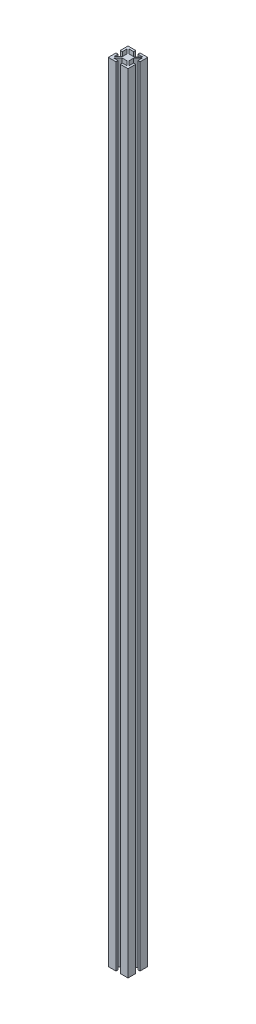
ISO-10303-21;
HEADER;
FILE_DESCRIPTION(('STEP AP214'),'2;1');
FILE_NAME('part.step','',(''),(''),'','','');
FILE_SCHEMA(('AUTOMOTIVE_DESIGN { 1 0 10303 214 1 1 1 1 }'));
ENDSEC;
DATA;
#1=APPLICATION_CONTEXT('core data for automotive mechanical design processes');
#2=APPLICATION_PROTOCOL_DEFINITION('international standard','automotive_design',2000,#1);
#3=PRODUCT_CONTEXT('',#1,'mechanical');
#4=PRODUCT('Part','Part','',(#3));
#5=PRODUCT_RELATED_PRODUCT_CATEGORY('part','',(#4));
#6=PRODUCT_DEFINITION_FORMATION('','',#4);
#7=PRODUCT_DEFINITION_CONTEXT('part definition',#1,'design');
#8=PRODUCT_DEFINITION('design','',#6,#7);
#9=PRODUCT_DEFINITION_SHAPE('','',#8);
#10=(LENGTH_UNIT() NAMED_UNIT(*) SI_UNIT(.MILLI.,.METRE.));
#11=(NAMED_UNIT(*) PLANE_ANGLE_UNIT() SI_UNIT($,.RADIAN.));
#12=(NAMED_UNIT(*) SI_UNIT($,.STERADIAN.) SOLID_ANGLE_UNIT());
#13=UNCERTAINTY_MEASURE_WITH_UNIT(LENGTH_MEASURE(1.E-05),#10,'distance_accuracy_value','');
#14=(GEOMETRIC_REPRESENTATION_CONTEXT(3) GLOBAL_UNCERTAINTY_ASSIGNED_CONTEXT((#13)) GLOBAL_UNIT_ASSIGNED_CONTEXT((#10,
#11,#12)) REPRESENTATION_CONTEXT('',''));
#15=CARTESIAN_POINT('',(0.,0.,0.));
#16=DIRECTION('',(0.,0.,1.));
#17=DIRECTION('',(1.,0.,0.));
#18=AXIS2_PLACEMENT_3D('',#15,#16,#17);
#19=CARTESIAN_POINT('',(-6.7564,1524.,4.364749804381));
#20=DIRECTION('',(0.707106781186549,0.,0.707106781186546));
#21=DIRECTION('',(0.707106781186546,0.,-0.707106781186549));
#22=AXIS2_PLACEMENT_3D('',#19,#20,#21);
#23=PLANE('',#22);
#24=DIRECTION('',(-0.707106781186546,0.,0.707106781186549));
#25=VECTOR('',#24,1.);
#26=CARTESIAN_POINT('',(-6.7564,0.,4.364749804381));
#27=LINE('',#26,#25);
#28=CARTESIAN_POINT('',(-6.7564,0.,4.364749804381));
#29=VERTEX_POINT('',#28);
#30=CARTESIAN_POINT('',(-14.986,0.,12.594349804381));
#31=VERTEX_POINT('',#30);
#32=EDGE_CURVE('E294',#29,#31,#27,.T.);
#33=ORIENTED_EDGE('',*,*,#32,.T.);
#34=DIRECTION('',(0.,-1.,0.));
#35=VECTOR('',#34,1.);
#36=CARTESIAN_POINT('',(-14.986,1524.,12.594349804381));
#37=LINE('',#36,#35);
#38=CARTESIAN_POINT('',(-14.986,1524.,12.594349804381));
#39=VERTEX_POINT('',#38);
#40=EDGE_CURVE('E11',#39,#31,#37,.T.);
#41=ORIENTED_EDGE('',*,*,#40,.F.);
#42=DIRECTION('',(-0.707106781186546,0.,0.707106781186549));
#43=VECTOR('',#42,1.);
#44=CARTESIAN_POINT('',(-6.7564,1524.,4.364749804381));
#45=LINE('',#44,#43);
#46=CARTESIAN_POINT('',(-6.7564,1524.,4.364749804381));
#47=VERTEX_POINT('',#46);
#48=EDGE_CURVE('E364',#47,#39,#45,.T.);
#49=ORIENTED_EDGE('',*,*,#48,.F.);
#50=DIRECTION('',(0.,-1.,0.));
#51=VECTOR('',#50,1.);
#52=CARTESIAN_POINT('',(-6.7564,1524.,4.364749804381));
#53=LINE('',#52,#51);
#54=EDGE_CURVE('E290',#47,#29,#53,.T.);
#55=ORIENTED_EDGE('',*,*,#54,.T.);
#56=EDGE_LOOP('',(#33,#41,#49,#55));
#57=FACE_BOUND('',#56,.T.);
#58=ADVANCED_FACE('F30',(#57),#23,.F.);
#59=CARTESIAN_POINT('',(-14.986,1524.,12.594349804381));
#60=DIRECTION('',(-1.,0.,0.));
#61=DIRECTION('',(0.,0.,1.));
#62=AXIS2_PLACEMENT_3D('',#59,#60,#61);
#63=PLANE('',#62);
#64=DIRECTION('',(0.,0.,-1.));
#65=VECTOR('',#64,1.);
#66=CARTESIAN_POINT('',(-14.986,0.,12.594349804381));
#67=LINE('',#66,#65);
#68=CARTESIAN_POINT('',(-14.986,0.,4.064));
#69=VERTEX_POINT('',#68);
#70=EDGE_CURVE('E297',#31,#69,#67,.T.);
#71=ORIENTED_EDGE('',*,*,#70,.T.);
#72=DIRECTION('',(0.,-1.,0.));
#73=VECTOR('',#72,1.);
#74=CARTESIAN_POINT('',(-14.986,1524.,4.064));
#75=LINE('',#74,#73);
#76=CARTESIAN_POINT('',(-14.986,1524.,4.064));
#77=VERTEX_POINT('',#76);
#78=EDGE_CURVE('E38',#77,#69,#75,.T.);
#79=ORIENTED_EDGE('',*,*,#78,.F.);
#80=DIRECTION('',(0.,0.,-1.));
#81=VECTOR('',#80,1.);
#82=CARTESIAN_POINT('',(-14.986,1524.,12.594349804381));
#83=LINE('',#82,#81);
#84=EDGE_CURVE('E173',#39,#77,#83,.T.);
#85=ORIENTED_EDGE('',*,*,#84,.F.);
#86=ORIENTED_EDGE('',*,*,#40,.T.);
#87=EDGE_LOOP('',(#71,#79,#85,#86));
#88=FACE_BOUND('',#87,.T.);
#89=ADVANCED_FACE('F562',(#88),#63,.F.);
#90=CARTESIAN_POINT('',(-14.986,1524.,4.064));
#91=DIRECTION('',(0.,0.,1.));
#92=DIRECTION('',(1.,0.,0.));
#93=AXIS2_PLACEMENT_3D('',#90,#91,#92);
#94=PLANE('',#93);
#95=DIRECTION('',(-1.,0.,0.));
#96=VECTOR('',#95,1.);
#97=CARTESIAN_POINT('',(-14.986,0.,4.064));
#98=LINE('',#97,#96);
#99=CARTESIAN_POINT('',(-19.05,0.,4.064));
#100=VERTEX_POINT('',#99);
#101=EDGE_CURVE('E299',#69,#100,#98,.T.);
#102=ORIENTED_EDGE('',*,*,#101,.T.);
#103=DIRECTION('',(0.,-1.,0.));
#104=VECTOR('',#103,1.);
#105=CARTESIAN_POINT('',(-19.05,1524.,4.064));
#106=LINE('',#105,#104);
#107=CARTESIAN_POINT('',(-19.05,1524.,4.064));
#108=VERTEX_POINT('',#107);
#109=EDGE_CURVE('E455',#108,#100,#106,.T.);
#110=ORIENTED_EDGE('',*,*,#109,.F.);
#111=DIRECTION('',(-1.,0.,0.));
#112=VECTOR('',#111,1.);
#113=CARTESIAN_POINT('',(-14.986,1524.,4.064));
#114=LINE('',#113,#112);
#115=EDGE_CURVE('E463',#77,#108,#114,.T.);
#116=ORIENTED_EDGE('',*,*,#115,.F.);
#117=ORIENTED_EDGE('',*,*,#78,.T.);
#118=EDGE_LOOP('',(#102,#110,#116,#117));
#119=FACE_BOUND('',#118,.T.);
#120=ADVANCED_FACE('F461',(#119),#94,.F.);
#121=CARTESIAN_POINT('',(-19.05,1524.,4.064));
#122=DIRECTION('',(1.,0.,0.));
#123=DIRECTION('',(0.,0.,-1.));
#124=AXIS2_PLACEMENT_3D('',#121,#122,#123);
#125=PLANE('',#124);
#126=DIRECTION('',(0.,0.,1.));
#127=VECTOR('',#126,1.);
#128=CARTESIAN_POINT('',(-19.05,0.,4.064));
#129=LINE('',#128,#127);
#130=CARTESIAN_POINT('',(-19.05,0.,19.05));
#131=VERTEX_POINT('',#130);
#132=EDGE_CURVE('E301',#100,#131,#129,.T.);
#133=ORIENTED_EDGE('',*,*,#132,.T.);
#134=DIRECTION('',(0.,-1.,0.));
#135=VECTOR('',#134,1.);
#136=CARTESIAN_POINT('',(-19.05,1524.,19.05));
#137=LINE('',#136,#135);
#138=CARTESIAN_POINT('',(-19.05,1524.,19.05));
#139=VERTEX_POINT('',#138);
#140=EDGE_CURVE('E452',#139,#131,#137,.T.);
#141=ORIENTED_EDGE('',*,*,#140,.F.);
#142=DIRECTION('',(0.,0.,1.));
#143=VECTOR('',#142,1.);
#144=CARTESIAN_POINT('',(-19.05,1524.,4.064));
#145=LINE('',#144,#143);
#146=EDGE_CURVE('E481',#108,#139,#145,.T.);
#147=ORIENTED_EDGE('',*,*,#146,.F.);
#148=ORIENTED_EDGE('',*,*,#109,.T.);
#149=EDGE_LOOP('',(#133,#141,#147,#148));
#150=FACE_BOUND('',#149,.T.);
#151=ADVANCED_FACE('F472',(#150),#125,.F.);
#152=CARTESIAN_POINT('',(-19.05,1524.,19.05));
#153=DIRECTION('',(0.,0.,-1.));
#154=DIRECTION('',(-1.,0.,0.));
#155=AXIS2_PLACEMENT_3D('',#152,#153,#154);
#156=PLANE('',#155);
#157=DIRECTION('',(1.,0.,0.));
#158=VECTOR('',#157,1.);
#159=CARTESIAN_POINT('',(-19.05,0.,19.05));
#160=LINE('',#159,#158);
#161=CARTESIAN_POINT('',(-4.064,0.,19.05));
#162=VERTEX_POINT('',#161);
#163=EDGE_CURVE('E303',#131,#162,#160,.T.);
#164=ORIENTED_EDGE('',*,*,#163,.T.);
#165=DIRECTION('',(0.,-1.,0.));
#166=VECTOR('',#165,1.);
#167=CARTESIAN_POINT('',(-4.064,1524.,19.05));
#168=LINE('',#167,#166);
#169=CARTESIAN_POINT('',(-4.064,1524.,19.05));
#170=VERTEX_POINT('',#169);
#171=EDGE_CURVE('E449',#170,#162,#168,.T.);
#172=ORIENTED_EDGE('',*,*,#171,.F.);
#173=DIRECTION('',(1.,0.,0.));
#174=VECTOR('',#173,1.);
#175=CARTESIAN_POINT('',(-19.05,1524.,19.05));
#176=LINE('',#175,#174);
#177=EDGE_CURVE('E478',#139,#170,#176,.T.);
#178=ORIENTED_EDGE('',*,*,#177,.F.);
#179=ORIENTED_EDGE('',*,*,#140,.T.);
#180=EDGE_LOOP('',(#164,#172,#178,#179));
#181=FACE_BOUND('',#180,.T.);
#182=ADVANCED_FACE('F476',(#181),#156,.F.);
#183=CARTESIAN_POINT('',(-4.064,1524.,19.05));
#184=DIRECTION('',(-1.,0.,0.));
#185=DIRECTION('',(0.,0.,1.));
#186=AXIS2_PLACEMENT_3D('',#183,#184,#185);
#187=PLANE('',#186);
#188=DIRECTION('',(0.,0.,-1.));
#189=VECTOR('',#188,1.);
#190=CARTESIAN_POINT('',(-4.064,0.,19.05));
#191=LINE('',#190,#189);
#192=CARTESIAN_POINT('',(-4.064,0.,14.986));
#193=VERTEX_POINT('',#192);
#194=EDGE_CURVE('E305',#162,#193,#191,.T.);
#195=ORIENTED_EDGE('',*,*,#194,.T.);
#196=DIRECTION('',(0.,-1.,0.));
#197=VECTOR('',#196,1.);
#198=CARTESIAN_POINT('',(-4.064,1524.,14.986));
#199=LINE('',#198,#197);
#200=CARTESIAN_POINT('',(-4.064,1524.,14.986));
#201=VERTEX_POINT('',#200);
#202=EDGE_CURVE('E446',#201,#193,#199,.T.);
#203=ORIENTED_EDGE('',*,*,#202,.F.);
#204=DIRECTION('',(0.,0.,-1.));
#205=VECTOR('',#204,1.);
#206=CARTESIAN_POINT('',(-4.064,1524.,19.05));
#207=LINE('',#206,#205);
#208=EDGE_CURVE('E480',#170,#201,#207,.T.);
#209=ORIENTED_EDGE('',*,*,#208,.F.);
#210=ORIENTED_EDGE('',*,*,#171,.T.);
#211=EDGE_LOOP('',(#195,#203,#209,#210));
#212=FACE_BOUND('',#211,.T.);
#213=ADVANCED_FACE('F575',(#212),#187,.F.);
#214=CARTESIAN_POINT('',(-4.064,1524.,14.986));
#215=DIRECTION('',(0.,0.,1.));
#216=DIRECTION('',(1.,0.,0.));
#217=AXIS2_PLACEMENT_3D('',#214,#215,#216);
#218=PLANE('',#217);
#219=DIRECTION('',(-1.,0.,0.));
#220=VECTOR('',#219,1.);
#221=CARTESIAN_POINT('',(-4.064,0.,14.986));
#222=LINE('',#221,#220);
#223=CARTESIAN_POINT('',(-13.0671272575058,0.,14.986));
#224=VERTEX_POINT('',#223);
#225=EDGE_CURVE('E307',#193,#224,#222,.T.);
#226=ORIENTED_EDGE('',*,*,#225,.T.);
#227=DIRECTION('',(0.,-1.,0.));
#228=VECTOR('',#227,1.);
#229=CARTESIAN_POINT('',(-13.0671272575058,1524.,14.986));
#230=LINE('',#229,#228);
#231=CARTESIAN_POINT('',(-13.0671272575058,1524.,14.986));
#232=VERTEX_POINT('',#231);
#233=EDGE_CURVE('E443',#232,#224,#230,.T.);
#234=ORIENTED_EDGE('',*,*,#233,.F.);
#235=DIRECTION('',(-1.,0.,0.));
#236=VECTOR('',#235,1.);
#237=CARTESIAN_POINT('',(-4.064,1524.,14.986));
#238=LINE('',#237,#236);
#239=EDGE_CURVE('E483',#201,#232,#238,.T.);
#240=ORIENTED_EDGE('',*,*,#239,.F.);
#241=ORIENTED_EDGE('',*,*,#202,.T.);
#242=EDGE_LOOP('',(#226,#234,#240,#241));
#243=FACE_BOUND('',#242,.T.);
#244=ADVANCED_FACE('F578',(#243),#218,.F.);
#245=CARTESIAN_POINT('',(-13.0671272575058,1524.,14.986));
#246=DIRECTION('',(-0.707106781186549,0.,-0.707106781186546));
#247=DIRECTION('',(-0.707106781186546,0.,0.707106781186549));
#248=AXIS2_PLACEMENT_3D('',#245,#246,#247);
#249=PLANE('',#248);
#250=DIRECTION('',(0.707106781186546,0.,-0.707106781186549));
#251=VECTOR('',#250,1.);
#252=CARTESIAN_POINT('',(-13.0671272575058,0.,14.986));
#253=LINE('',#252,#251);
#254=CARTESIAN_POINT('',(-4.83752725750581,0.,6.7564));
#255=VERTEX_POINT('',#254);
#256=EDGE_CURVE('E309',#224,#255,#253,.T.);
#257=ORIENTED_EDGE('',*,*,#256,.T.);
#258=DIRECTION('',(0.,-1.,0.));
#259=VECTOR('',#258,1.);
#260=CARTESIAN_POINT('',(-4.83752725750581,1524.,6.7564));
#261=LINE('',#260,#259);
#262=CARTESIAN_POINT('',(-4.83752725750581,1524.,6.7564));
#263=VERTEX_POINT('',#262);
#264=EDGE_CURVE('E440',#263,#255,#261,.T.);
#265=ORIENTED_EDGE('',*,*,#264,.F.);
#266=DIRECTION('',(0.707106781186546,0.,-0.707106781186549));
#267=VECTOR('',#266,1.);
#268=CARTESIAN_POINT('',(-13.0671272575058,1524.,14.986));
#269=LINE('',#268,#267);
#270=EDGE_CURVE('E489',#232,#263,#269,.T.);
#271=ORIENTED_EDGE('',*,*,#270,.F.);
#272=ORIENTED_EDGE('',*,*,#233,.T.);
#273=EDGE_LOOP('',(#257,#265,#271,#272));
#274=FACE_BOUND('',#273,.T.);
#275=ADVANCED_FACE('F582',(#274),#249,.F.);
#276=CARTESIAN_POINT('',(-4.83752725750581,1524.,6.7564));
#277=DIRECTION('',(0.,0.,-1.));
#278=DIRECTION('',(-1.,0.,0.));
#279=AXIS2_PLACEMENT_3D('',#276,#277,#278);
#280=PLANE('',#279);
#281=DIRECTION('',(1.,0.,0.));
#282=VECTOR('',#281,1.);
#283=CARTESIAN_POINT('',(-4.83752725750581,0.,6.7564));
#284=LINE('',#283,#282);
#285=CARTESIAN_POINT('',(4.83752725750581,0.,6.7564));
#286=VERTEX_POINT('',#285);
#287=EDGE_CURVE('E311',#255,#286,#284,.T.);
#288=ORIENTED_EDGE('',*,*,#287,.T.);
#289=DIRECTION('',(0.,-1.,0.));
#290=VECTOR('',#289,1.);
#291=CARTESIAN_POINT('',(4.83752725750581,1524.,6.7564));
#292=LINE('',#291,#290);
#293=CARTESIAN_POINT('',(4.83752725750581,1524.,6.7564));
#294=VERTEX_POINT('',#293);
#295=EDGE_CURVE('E437',#294,#286,#292,.T.);
#296=ORIENTED_EDGE('',*,*,#295,.F.);
#297=DIRECTION('',(1.,0.,0.));
#298=VECTOR('',#297,1.);
#299=CARTESIAN_POINT('',(-4.83752725750581,1524.,6.7564));
#300=LINE('',#299,#298);
#301=EDGE_CURVE('E491',#263,#294,#300,.T.);
#302=ORIENTED_EDGE('',*,*,#301,.F.);
#303=ORIENTED_EDGE('',*,*,#264,.T.);
#304=EDGE_LOOP('',(#288,#296,#302,#303));
#305=FACE_BOUND('',#304,.T.);
#306=ADVANCED_FACE('F586',(#305),#280,.F.);
#307=CARTESIAN_POINT('',(13.0671272575058,1524.,14.986));
#308=DIRECTION('',(0.707106781186549,0.,-0.707106781186546));
#309=DIRECTION('',(-0.707106781186546,0.,-0.707106781186549));
#310=AXIS2_PLACEMENT_3D('',#307,#308,#309);
#311=PLANE('',#310);
#312=DIRECTION('',(0.707106781186546,0.,0.707106781186549));
#313=VECTOR('',#312,1.);
#314=CARTESIAN_POINT('',(13.0671272575058,0.,14.986));
#315=LINE('',#314,#313);
#316=CARTESIAN_POINT('',(13.0671272575058,0.,14.986));
#317=VERTEX_POINT('',#316);
#318=EDGE_CURVE('E313',#286,#317,#315,.T.);
#319=ORIENTED_EDGE('',*,*,#318,.T.);
#320=DIRECTION('',(0.,-1.,0.));
#321=VECTOR('',#320,1.);
#322=CARTESIAN_POINT('',(13.0671272575058,1524.,14.986));
#323=LINE('',#322,#321);
#324=CARTESIAN_POINT('',(13.0671272575058,1524.,14.986));
#325=VERTEX_POINT('',#324);
#326=EDGE_CURVE('E434',#325,#317,#323,.T.);
#327=ORIENTED_EDGE('',*,*,#326,.F.);
#328=DIRECTION('',(0.707106781186546,0.,0.707106781186549));
#329=VECTOR('',#328,1.);
#330=CARTESIAN_POINT('',(13.0671272575058,1524.,14.986));
#331=LINE('',#330,#329);
#332=EDGE_CURVE('E493',#294,#325,#331,.T.);
#333=ORIENTED_EDGE('',*,*,#332,.F.);
#334=ORIENTED_EDGE('',*,*,#295,.T.);
#335=EDGE_LOOP('',(#319,#327,#333,#334));
#336=FACE_BOUND('',#335,.T.);
#337=ADVANCED_FACE('F590',(#336),#311,.F.);
#338=CARTESIAN_POINT('',(4.064,1524.,14.986));
#339=DIRECTION('',(0.,0.,1.));
#340=DIRECTION('',(1.,0.,0.));
#341=AXIS2_PLACEMENT_3D('',#338,#339,#340);
#342=PLANE('',#341);
#343=DIRECTION('',(-1.,0.,0.));
#344=VECTOR('',#343,1.);
#345=CARTESIAN_POINT('',(4.064,0.,14.986));
#346=LINE('',#345,#344);
#347=CARTESIAN_POINT('',(4.064,0.,14.986));
#348=VERTEX_POINT('',#347);
#349=EDGE_CURVE('E315',#317,#348,#346,.T.);
#350=ORIENTED_EDGE('',*,*,#349,.T.);
#351=DIRECTION('',(0.,-1.,0.));
#352=VECTOR('',#351,1.);
#353=CARTESIAN_POINT('',(4.064,1524.,14.986));
#354=LINE('',#353,#352);
#355=CARTESIAN_POINT('',(4.064,1524.,14.986));
#356=VERTEX_POINT('',#355);
#357=EDGE_CURVE('E431',#356,#348,#354,.T.);
#358=ORIENTED_EDGE('',*,*,#357,.F.);
#359=DIRECTION('',(-1.,0.,0.));
#360=VECTOR('',#359,1.);
#361=CARTESIAN_POINT('',(4.064,1524.,14.986));
#362=LINE('',#361,#360);
#363=EDGE_CURVE('E495',#325,#356,#362,.T.);
#364=ORIENTED_EDGE('',*,*,#363,.F.);
#365=ORIENTED_EDGE('',*,*,#326,.T.);
#366=EDGE_LOOP('',(#350,#358,#364,#365));
#367=FACE_BOUND('',#366,.T.);
#368=ADVANCED_FACE('F594',(#367),#342,.F.);
#369=CARTESIAN_POINT('',(4.064,1524.,19.05));
#370=DIRECTION('',(1.,0.,0.));
#371=DIRECTION('',(0.,0.,-1.));
#372=AXIS2_PLACEMENT_3D('',#369,#370,#371);
#373=PLANE('',#372);
#374=DIRECTION('',(0.,0.,1.));
#375=VECTOR('',#374,1.);
#376=CARTESIAN_POINT('',(4.064,0.,19.05));
#377=LINE('',#376,#375);
#378=CARTESIAN_POINT('',(4.064,0.,19.05));
#379=VERTEX_POINT('',#378);
#380=EDGE_CURVE('E317',#348,#379,#377,.T.);
#381=ORIENTED_EDGE('',*,*,#380,.T.);
#382=DIRECTION('',(0.,-1.,0.));
#383=VECTOR('',#382,1.);
#384=CARTESIAN_POINT('',(4.064,1524.,19.05));
#385=LINE('',#384,#383);
#386=CARTESIAN_POINT('',(4.064,1524.,19.05));
#387=VERTEX_POINT('',#386);
#388=EDGE_CURVE('E428',#387,#379,#385,.T.);
#389=ORIENTED_EDGE('',*,*,#388,.F.);
#390=DIRECTION('',(0.,0.,1.));
#391=VECTOR('',#390,1.);
#392=CARTESIAN_POINT('',(4.064,1524.,19.05));
#393=LINE('',#392,#391);
#394=EDGE_CURVE('E497',#356,#387,#393,.T.);
#395=ORIENTED_EDGE('',*,*,#394,.F.);
#396=ORIENTED_EDGE('',*,*,#357,.T.);
#397=EDGE_LOOP('',(#381,#389,#395,#396));
#398=FACE_BOUND('',#397,.T.);
#399=ADVANCED_FACE('F598',(#398),#373,.F.);
#400=CARTESIAN_POINT('',(19.05,1524.,19.05));
#401=DIRECTION('',(0.,0.,-1.));
#402=DIRECTION('',(-1.,0.,0.));
#403=AXIS2_PLACEMENT_3D('',#400,#401,#402);
#404=PLANE('',#403);
#405=DIRECTION('',(1.,0.,0.));
#406=VECTOR('',#405,1.);
#407=CARTESIAN_POINT('',(19.05,0.,19.05));
#408=LINE('',#407,#406);
#409=CARTESIAN_POINT('',(19.05,0.,19.05));
#410=VERTEX_POINT('',#409);
#411=EDGE_CURVE('E319',#379,#410,#408,.T.);
#412=ORIENTED_EDGE('',*,*,#411,.T.);
#413=DIRECTION('',(0.,-1.,0.));
#414=VECTOR('',#413,1.);
#415=CARTESIAN_POINT('',(19.05,1524.,19.05));
#416=LINE('',#415,#414);
#417=CARTESIAN_POINT('',(19.05,1524.,19.05));
#418=VERTEX_POINT('',#417);
#419=EDGE_CURVE('E425',#418,#410,#416,.T.);
#420=ORIENTED_EDGE('',*,*,#419,.F.);
#421=DIRECTION('',(1.,0.,0.));
#422=VECTOR('',#421,1.);
#423=CARTESIAN_POINT('',(19.05,1524.,19.05));
#424=LINE('',#423,#422);
#425=EDGE_CURVE('E499',#387,#418,#424,.T.);
#426=ORIENTED_EDGE('',*,*,#425,.F.);
#427=ORIENTED_EDGE('',*,*,#388,.T.);
#428=EDGE_LOOP('',(#412,#420,#426,#427));
#429=FACE_BOUND('',#428,.T.);
#430=ADVANCED_FACE('F602',(#429),#404,.F.);
#431=CARTESIAN_POINT('',(19.05,1524.,4.064));
#432=DIRECTION('',(-1.,0.,0.));
#433=DIRECTION('',(0.,0.,1.));
#434=AXIS2_PLACEMENT_3D('',#431,#432,#433);
#435=PLANE('',#434);
#436=DIRECTION('',(0.,0.,-1.));
#437=VECTOR('',#436,1.);
#438=CARTESIAN_POINT('',(19.05,0.,4.064));
#439=LINE('',#438,#437);
#440=CARTESIAN_POINT('',(19.05,0.,4.064));
#441=VERTEX_POINT('',#440);
#442=EDGE_CURVE('E321',#410,#441,#439,.T.);
#443=ORIENTED_EDGE('',*,*,#442,.T.);
#444=DIRECTION('',(0.,-1.,0.));
#445=VECTOR('',#444,1.);
#446=CARTESIAN_POINT('',(19.05,1524.,4.064));
#447=LINE('',#446,#445);
#448=CARTESIAN_POINT('',(19.05,1524.,4.064));
#449=VERTEX_POINT('',#448);
#450=EDGE_CURVE('E422',#449,#441,#447,.T.);
#451=ORIENTED_EDGE('',*,*,#450,.F.);
#452=DIRECTION('',(0.,0.,-1.));
#453=VECTOR('',#452,1.);
#454=CARTESIAN_POINT('',(19.05,1524.,4.064));
#455=LINE('',#454,#453);
#456=EDGE_CURVE('E501',#418,#449,#455,.T.);
#457=ORIENTED_EDGE('',*,*,#456,.F.);
#458=ORIENTED_EDGE('',*,*,#419,.T.);
#459=EDGE_LOOP('',(#443,#451,#457,#458));
#460=FACE_BOUND('',#459,.T.);
#461=ADVANCED_FACE('F606',(#460),#435,.F.);
#462=CARTESIAN_POINT('',(14.986,1524.,4.064));
#463=DIRECTION('',(0.,0.,1.));
#464=DIRECTION('',(1.,0.,0.));
#465=AXIS2_PLACEMENT_3D('',#462,#463,#464);
#466=PLANE('',#465);
#467=DIRECTION('',(-1.,0.,0.));
#468=VECTOR('',#467,1.);
#469=CARTESIAN_POINT('',(14.986,0.,4.064));
#470=LINE('',#469,#468);
#471=CARTESIAN_POINT('',(14.986,0.,4.064));
#472=VERTEX_POINT('',#471);
#473=EDGE_CURVE('E323',#441,#472,#470,.T.);
#474=ORIENTED_EDGE('',*,*,#473,.T.);
#475=DIRECTION('',(0.,-1.,0.));
#476=VECTOR('',#475,1.);
#477=CARTESIAN_POINT('',(14.986,1524.,4.064));
#478=LINE('',#477,#476);
#479=CARTESIAN_POINT('',(14.986,1524.,4.064));
#480=VERTEX_POINT('',#479);
#481=EDGE_CURVE('E419',#480,#472,#478,.T.);
#482=ORIENTED_EDGE('',*,*,#481,.F.);
#483=DIRECTION('',(-1.,0.,0.));
#484=VECTOR('',#483,1.);
#485=CARTESIAN_POINT('',(14.986,1524.,4.064));
#486=LINE('',#485,#484);
#487=EDGE_CURVE('E503',#449,#480,#486,.T.);
#488=ORIENTED_EDGE('',*,*,#487,.F.);
#489=ORIENTED_EDGE('',*,*,#450,.T.);
#490=EDGE_LOOP('',(#474,#482,#488,#489));
#491=FACE_BOUND('',#490,.T.);
#492=ADVANCED_FACE('F610',(#491),#466,.F.);
#493=CARTESIAN_POINT('',(14.986,1524.,12.594349804381));
#494=DIRECTION('',(1.,0.,0.));
#495=DIRECTION('',(0.,0.,-1.));
#496=AXIS2_PLACEMENT_3D('',#493,#494,#495);
#497=PLANE('',#496);
#498=DIRECTION('',(0.,0.,1.));
#499=VECTOR('',#498,1.);
#500=CARTESIAN_POINT('',(14.986,0.,12.594349804381));
#501=LINE('',#500,#499);
#502=CARTESIAN_POINT('',(14.986,0.,12.594349804381));
#503=VERTEX_POINT('',#502);
#504=EDGE_CURVE('E325',#472,#503,#501,.T.);
#505=ORIENTED_EDGE('',*,*,#504,.T.);
#506=DIRECTION('',(0.,-1.,0.));
#507=VECTOR('',#506,1.);
#508=CARTESIAN_POINT('',(14.986,1524.,12.594349804381));
#509=LINE('',#508,#507);
#510=CARTESIAN_POINT('',(14.986,1524.,12.594349804381));
#511=VERTEX_POINT('',#510);
#512=EDGE_CURVE('E416',#511,#503,#509,.T.);
#513=ORIENTED_EDGE('',*,*,#512,.F.);
#514=DIRECTION('',(0.,0.,1.));
#515=VECTOR('',#514,1.);
#516=CARTESIAN_POINT('',(14.986,1524.,12.594349804381));
#517=LINE('',#516,#515);
#518=EDGE_CURVE('E505',#480,#511,#517,.T.);
#519=ORIENTED_EDGE('',*,*,#518,.F.);
#520=ORIENTED_EDGE('',*,*,#481,.T.);
#521=EDGE_LOOP('',(#505,#513,#519,#520));
#522=FACE_BOUND('',#521,.T.);
#523=ADVANCED_FACE('F614',(#522),#497,.F.);
#524=CARTESIAN_POINT('',(6.7564,1524.,4.36474980438099));
#525=DIRECTION('',(-0.707106781186549,0.,0.707106781186546));
#526=DIRECTION('',(0.707106781186546,0.,0.707106781186549));
#527=AXIS2_PLACEMENT_3D('',#524,#525,#526);
#528=PLANE('',#527);
#529=DIRECTION('',(-0.707106781186546,0.,-0.707106781186549));
#530=VECTOR('',#529,1.);
#531=CARTESIAN_POINT('',(6.7564,0.,4.36474980438099));
#532=LINE('',#531,#530);
#533=CARTESIAN_POINT('',(6.7564,0.,4.36474980438099));
#534=VERTEX_POINT('',#533);
#535=EDGE_CURVE('E327',#503,#534,#532,.T.);
#536=ORIENTED_EDGE('',*,*,#535,.T.);
#537=DIRECTION('',(0.,-1.,0.));
#538=VECTOR('',#537,1.);
#539=CARTESIAN_POINT('',(6.7564,1524.,4.36474980438099));
#540=LINE('',#539,#538);
#541=CARTESIAN_POINT('',(6.7564,1524.,4.36474980438099));
#542=VERTEX_POINT('',#541);
#543=EDGE_CURVE('E413',#542,#534,#540,.T.);
#544=ORIENTED_EDGE('',*,*,#543,.F.);
#545=DIRECTION('',(-0.707106781186546,0.,-0.707106781186549));
#546=VECTOR('',#545,1.);
#547=CARTESIAN_POINT('',(6.7564,1524.,4.36474980438099));
#548=LINE('',#547,#546);
#549=EDGE_CURVE('E507',#511,#542,#548,.T.);
#550=ORIENTED_EDGE('',*,*,#549,.F.);
#551=ORIENTED_EDGE('',*,*,#512,.T.);
#552=EDGE_LOOP('',(#536,#544,#550,#551));
#553=FACE_BOUND('',#552,.T.);
#554=ADVANCED_FACE('F618',(#553),#528,.F.);
#555=CARTESIAN_POINT('',(6.7564,1524.,-4.364749804381));
#556=DIRECTION('',(-1.,0.,0.));
#557=DIRECTION('',(0.,0.,1.));
#558=AXIS2_PLACEMENT_3D('',#555,#556,#557);
#559=PLANE('',#558);
#560=DIRECTION('',(0.,0.,-1.));
#561=VECTOR('',#560,1.);
#562=CARTESIAN_POINT('',(6.7564,0.,-4.364749804381));
#563=LINE('',#562,#561);
#564=CARTESIAN_POINT('',(6.7564,0.,-4.364749804381));
#565=VERTEX_POINT('',#564);
#566=EDGE_CURVE('E329',#534,#565,#563,.T.);
#567=ORIENTED_EDGE('',*,*,#566,.T.);
#568=DIRECTION('',(0.,-1.,0.));
#569=VECTOR('',#568,1.);
#570=CARTESIAN_POINT('',(6.7564,1524.,-4.364749804381));
#571=LINE('',#570,#569);
#572=CARTESIAN_POINT('',(6.7564,1524.,-4.364749804381));
#573=VERTEX_POINT('',#572);
#574=EDGE_CURVE('E410',#573,#565,#571,.T.);
#575=ORIENTED_EDGE('',*,*,#574,.F.);
#576=DIRECTION('',(0.,0.,-1.));
#577=VECTOR('',#576,1.);
#578=CARTESIAN_POINT('',(6.7564,1524.,-4.364749804381));
#579=LINE('',#578,#577);
#580=EDGE_CURVE('E509',#542,#573,#579,.T.);
#581=ORIENTED_EDGE('',*,*,#580,.F.);
#582=ORIENTED_EDGE('',*,*,#543,.T.);
#583=EDGE_LOOP('',(#567,#575,#581,#582));
#584=FACE_BOUND('',#583,.T.);
#585=ADVANCED_FACE('F622',(#584),#559,.F.);
#586=CARTESIAN_POINT('',(6.7564,1524.,-4.364749804381));
#587=DIRECTION('',(-0.707106781186549,0.,-0.707106781186546));
#588=DIRECTION('',(-0.707106781186546,0.,0.707106781186549));
#589=AXIS2_PLACEMENT_3D('',#586,#587,#588);
#590=PLANE('',#589);
#591=DIRECTION('',(0.707106781186546,0.,-0.707106781186549));
#592=VECTOR('',#591,1.);
#593=CARTESIAN_POINT('',(6.7564,0.,-4.364749804381));
#594=LINE('',#593,#592);
#595=CARTESIAN_POINT('',(14.986,0.,-12.594349804381));
#596=VERTEX_POINT('',#595);
#597=EDGE_CURVE('E331',#565,#596,#594,.T.);
#598=ORIENTED_EDGE('',*,*,#597,.T.);
#599=DIRECTION('',(0.,-1.,0.));
#600=VECTOR('',#599,1.);
#601=CARTESIAN_POINT('',(14.986,1524.,-12.594349804381));
#602=LINE('',#601,#600);
#603=CARTESIAN_POINT('',(14.986,1524.,-12.594349804381));
#604=VERTEX_POINT('',#603);
#605=EDGE_CURVE('E407',#604,#596,#602,.T.);
#606=ORIENTED_EDGE('',*,*,#605,.F.);
#607=DIRECTION('',(0.707106781186546,0.,-0.707106781186549));
#608=VECTOR('',#607,1.);
#609=CARTESIAN_POINT('',(6.7564,1524.,-4.364749804381));
#610=LINE('',#609,#608);
#611=EDGE_CURVE('E511',#573,#604,#610,.T.);
#612=ORIENTED_EDGE('',*,*,#611,.F.);
#613=ORIENTED_EDGE('',*,*,#574,.T.);
#614=EDGE_LOOP('',(#598,#606,#612,#613));
#615=FACE_BOUND('',#614,.T.);
#616=ADVANCED_FACE('F626',(#615),#590,.F.);
#617=CARTESIAN_POINT('',(14.986,1524.,-12.594349804381));
#618=DIRECTION('',(1.,0.,0.));
#619=DIRECTION('',(0.,0.,-1.));
#620=AXIS2_PLACEMENT_3D('',#617,#618,#619);
#621=PLANE('',#620);
#622=DIRECTION('',(0.,0.,1.));
#623=VECTOR('',#622,1.);
#624=CARTESIAN_POINT('',(14.986,0.,-12.594349804381));
#625=LINE('',#624,#623);
#626=CARTESIAN_POINT('',(14.986,0.,-4.064));
#627=VERTEX_POINT('',#626);
#628=EDGE_CURVE('E333',#596,#627,#625,.T.);
#629=ORIENTED_EDGE('',*,*,#628,.T.);
#630=DIRECTION('',(0.,-1.,0.));
#631=VECTOR('',#630,1.);
#632=CARTESIAN_POINT('',(14.986,1524.,-4.064));
#633=LINE('',#632,#631);
#634=CARTESIAN_POINT('',(14.986,1524.,-4.064));
#635=VERTEX_POINT('',#634);
#636=EDGE_CURVE('E404',#635,#627,#633,.T.);
#637=ORIENTED_EDGE('',*,*,#636,.F.);
#638=DIRECTION('',(0.,0.,1.));
#639=VECTOR('',#638,1.);
#640=CARTESIAN_POINT('',(14.986,1524.,-12.594349804381));
#641=LINE('',#640,#639);
#642=EDGE_CURVE('E513',#604,#635,#641,.T.);
#643=ORIENTED_EDGE('',*,*,#642,.F.);
#644=ORIENTED_EDGE('',*,*,#605,.T.);
#645=EDGE_LOOP('',(#629,#637,#643,#644));
#646=FACE_BOUND('',#645,.T.);
#647=ADVANCED_FACE('F630',(#646),#621,.F.);
#648=CARTESIAN_POINT('',(14.986,1524.,-4.064));
#649=DIRECTION('',(0.,0.,-1.));
#650=DIRECTION('',(-1.,0.,0.));
#651=AXIS2_PLACEMENT_3D('',#648,#649,#650);
#652=PLANE('',#651);
#653=DIRECTION('',(1.,0.,0.));
#654=VECTOR('',#653,1.);
#655=CARTESIAN_POINT('',(14.986,0.,-4.064));
#656=LINE('',#655,#654);
#657=CARTESIAN_POINT('',(19.05,0.,-4.064));
#658=VERTEX_POINT('',#657);
#659=EDGE_CURVE('E335',#627,#658,#656,.T.);
#660=ORIENTED_EDGE('',*,*,#659,.T.);
#661=DIRECTION('',(0.,-1.,0.));
#662=VECTOR('',#661,1.);
#663=CARTESIAN_POINT('',(19.05,1524.,-4.064));
#664=LINE('',#663,#662);
#665=CARTESIAN_POINT('',(19.05,1524.,-4.064));
#666=VERTEX_POINT('',#665);
#667=EDGE_CURVE('E401',#666,#658,#664,.T.);
#668=ORIENTED_EDGE('',*,*,#667,.F.);
#669=DIRECTION('',(1.,0.,0.));
#670=VECTOR('',#669,1.);
#671=CARTESIAN_POINT('',(14.986,1524.,-4.064));
#672=LINE('',#671,#670);
#673=EDGE_CURVE('E515',#635,#666,#672,.T.);
#674=ORIENTED_EDGE('',*,*,#673,.F.);
#675=ORIENTED_EDGE('',*,*,#636,.T.);
#676=EDGE_LOOP('',(#660,#668,#674,#675));
#677=FACE_BOUND('',#676,.T.);
#678=ADVANCED_FACE('F634',(#677),#652,.F.);
#679=CARTESIAN_POINT('',(19.05,1524.,-4.064));
#680=DIRECTION('',(-1.,0.,0.));
#681=DIRECTION('',(0.,0.,1.));
#682=AXIS2_PLACEMENT_3D('',#679,#680,#681);
#683=PLANE('',#682);
#684=DIRECTION('',(0.,0.,-1.));
#685=VECTOR('',#684,1.);
#686=CARTESIAN_POINT('',(19.05,0.,-4.064));
#687=LINE('',#686,#685);
#688=CARTESIAN_POINT('',(19.05,0.,-19.05));
#689=VERTEX_POINT('',#688);
#690=EDGE_CURVE('E337',#658,#689,#687,.T.);
#691=ORIENTED_EDGE('',*,*,#690,.T.);
#692=DIRECTION('',(0.,-1.,0.));
#693=VECTOR('',#692,1.);
#694=CARTESIAN_POINT('',(19.05,1524.,-19.05));
#695=LINE('',#694,#693);
#696=CARTESIAN_POINT('',(19.05,1524.,-19.05));
#697=VERTEX_POINT('',#696);
#698=EDGE_CURVE('E398',#697,#689,#695,.T.);
#699=ORIENTED_EDGE('',*,*,#698,.F.);
#700=DIRECTION('',(0.,0.,-1.));
#701=VECTOR('',#700,1.);
#702=CARTESIAN_POINT('',(19.05,1524.,-4.064));
#703=LINE('',#702,#701);
#704=EDGE_CURVE('E517',#666,#697,#703,.T.);
#705=ORIENTED_EDGE('',*,*,#704,.F.);
#706=ORIENTED_EDGE('',*,*,#667,.T.);
#707=EDGE_LOOP('',(#691,#699,#705,#706));
#708=FACE_BOUND('',#707,.T.);
#709=ADVANCED_FACE('F638',(#708),#683,.F.);
#710=CARTESIAN_POINT('',(19.05,1524.,-19.05));
#711=DIRECTION('',(0.,0.,1.));
#712=DIRECTION('',(1.,0.,0.));
#713=AXIS2_PLACEMENT_3D('',#710,#711,#712);
#714=PLANE('',#713);
#715=DIRECTION('',(-1.,0.,0.));
#716=VECTOR('',#715,1.);
#717=CARTESIAN_POINT('',(19.05,0.,-19.05));
#718=LINE('',#717,#716);
#719=CARTESIAN_POINT('',(4.06399999999999,0.,-19.05));
#720=VERTEX_POINT('',#719);
#721=EDGE_CURVE('E339',#689,#720,#718,.T.);
#722=ORIENTED_EDGE('',*,*,#721,.T.);
#723=DIRECTION('',(0.,-1.,0.));
#724=VECTOR('',#723,1.);
#725=CARTESIAN_POINT('',(4.06399999999999,1524.,-19.05));
#726=LINE('',#725,#724);
#727=CARTESIAN_POINT('',(4.06399999999999,1524.,-19.05));
#728=VERTEX_POINT('',#727);
#729=EDGE_CURVE('E395',#728,#720,#726,.T.);
#730=ORIENTED_EDGE('',*,*,#729,.F.);
#731=DIRECTION('',(-1.,0.,0.));
#732=VECTOR('',#731,1.);
#733=CARTESIAN_POINT('',(19.05,1524.,-19.05));
#734=LINE('',#733,#732);
#735=EDGE_CURVE('E519',#697,#728,#734,.T.);
#736=ORIENTED_EDGE('',*,*,#735,.F.);
#737=ORIENTED_EDGE('',*,*,#698,.T.);
#738=EDGE_LOOP('',(#722,#730,#736,#737));
#739=FACE_BOUND('',#738,.T.);
#740=ADVANCED_FACE('F642',(#739),#714,.F.);
#741=CARTESIAN_POINT('',(4.06399999999999,1524.,-19.05));
#742=DIRECTION('',(1.,0.,0.));
#743=DIRECTION('',(0.,0.,-1.));
#744=AXIS2_PLACEMENT_3D('',#741,#742,#743);
#745=PLANE('',#744);
#746=DIRECTION('',(0.,0.,1.));
#747=VECTOR('',#746,1.);
#748=CARTESIAN_POINT('',(4.06399999999999,0.,-19.05));
#749=LINE('',#748,#747);
#750=CARTESIAN_POINT('',(4.06399999999999,0.,-14.986));
#751=VERTEX_POINT('',#750);
#752=EDGE_CURVE('E341',#720,#751,#749,.T.);
#753=ORIENTED_EDGE('',*,*,#752,.T.);
#754=DIRECTION('',(0.,-1.,0.));
#755=VECTOR('',#754,1.);
#756=CARTESIAN_POINT('',(4.06399999999999,1524.,-14.986));
#757=LINE('',#756,#755);
#758=CARTESIAN_POINT('',(4.06399999999999,1524.,-14.986));
#759=VERTEX_POINT('',#758);
#760=EDGE_CURVE('E392',#759,#751,#757,.T.);
#761=ORIENTED_EDGE('',*,*,#760,.F.);
#762=DIRECTION('',(0.,0.,1.));
#763=VECTOR('',#762,1.);
#764=CARTESIAN_POINT('',(4.06399999999999,1524.,-19.05));
#765=LINE('',#764,#763);
#766=EDGE_CURVE('E521',#728,#759,#765,.T.);
#767=ORIENTED_EDGE('',*,*,#766,.F.);
#768=ORIENTED_EDGE('',*,*,#729,.T.);
#769=EDGE_LOOP('',(#753,#761,#767,#768));
#770=FACE_BOUND('',#769,.T.);
#771=ADVANCED_FACE('F646',(#770),#745,.F.);
#772=CARTESIAN_POINT('',(4.06399999999999,1524.,-14.986));
#773=DIRECTION('',(0.,0.,-1.));
#774=DIRECTION('',(-1.,0.,0.));
#775=AXIS2_PLACEMENT_3D('',#772,#773,#774);
#776=PLANE('',#775);
#777=DIRECTION('',(1.,0.,0.));
#778=VECTOR('',#777,1.);
#779=CARTESIAN_POINT('',(4.06399999999999,0.,-14.986));
#780=LINE('',#779,#778);
#781=CARTESIAN_POINT('',(13.0671272575058,0.,-14.986));
#782=VERTEX_POINT('',#781);
#783=EDGE_CURVE('E343',#751,#782,#780,.T.);
#784=ORIENTED_EDGE('',*,*,#783,.T.);
#785=DIRECTION('',(0.,-1.,0.));
#786=VECTOR('',#785,1.);
#787=CARTESIAN_POINT('',(13.0671272575058,1524.,-14.986));
#788=LINE('',#787,#786);
#789=CARTESIAN_POINT('',(13.0671272575058,1524.,-14.986));
#790=VERTEX_POINT('',#789);
#791=EDGE_CURVE('E389',#790,#782,#788,.T.);
#792=ORIENTED_EDGE('',*,*,#791,.F.);
#793=DIRECTION('',(1.,0.,0.));
#794=VECTOR('',#793,1.);
#795=CARTESIAN_POINT('',(4.06399999999999,1524.,-14.986));
#796=LINE('',#795,#794);
#797=EDGE_CURVE('E523',#759,#790,#796,.T.);
#798=ORIENTED_EDGE('',*,*,#797,.F.);
#799=ORIENTED_EDGE('',*,*,#760,.T.);
#800=EDGE_LOOP('',(#784,#792,#798,#799));
#801=FACE_BOUND('',#800,.T.);
#802=ADVANCED_FACE('F650',(#801),#776,.F.);
#803=CARTESIAN_POINT('',(13.0671272575058,1524.,-14.986));
#804=DIRECTION('',(0.707106781186549,0.,0.707106781186546));
#805=DIRECTION('',(0.707106781186546,0.,-0.707106781186549));
#806=AXIS2_PLACEMENT_3D('',#803,#804,#805);
#807=PLANE('',#806);
#808=DIRECTION('',(-0.707106781186546,0.,0.707106781186549));
#809=VECTOR('',#808,1.);
#810=CARTESIAN_POINT('',(13.0671272575058,0.,-14.986));
#811=LINE('',#810,#809);
#812=CARTESIAN_POINT('',(4.83752725750581,0.,-6.7564));
#813=VERTEX_POINT('',#812);
#814=EDGE_CURVE('E345',#782,#813,#811,.T.);
#815=ORIENTED_EDGE('',*,*,#814,.T.);
#816=DIRECTION('',(0.,-1.,0.));
#817=VECTOR('',#816,1.);
#818=CARTESIAN_POINT('',(4.83752725750581,1524.,-6.7564));
#819=LINE('',#818,#817);
#820=CARTESIAN_POINT('',(4.83752725750581,1524.,-6.7564));
#821=VERTEX_POINT('',#820);
#822=EDGE_CURVE('E386',#821,#813,#819,.T.);
#823=ORIENTED_EDGE('',*,*,#822,.F.);
#824=DIRECTION('',(-0.707106781186546,0.,0.707106781186549));
#825=VECTOR('',#824,1.);
#826=CARTESIAN_POINT('',(13.0671272575058,1524.,-14.986));
#827=LINE('',#826,#825);
#828=EDGE_CURVE('E525',#790,#821,#827,.T.);
#829=ORIENTED_EDGE('',*,*,#828,.F.);
#830=ORIENTED_EDGE('',*,*,#791,.T.);
#831=EDGE_LOOP('',(#815,#823,#829,#830));
#832=FACE_BOUND('',#831,.T.);
#833=ADVANCED_FACE('F654',(#832),#807,.F.);
#834=CARTESIAN_POINT('',(-4.83752725750581,1524.,-6.7564));
#835=DIRECTION('',(0.,0.,1.));
#836=DIRECTION('',(1.,0.,0.));
#837=AXIS2_PLACEMENT_3D('',#834,#835,#836);
#838=PLANE('',#837);
#839=DIRECTION('',(-1.,0.,0.));
#840=VECTOR('',#839,1.);
#841=CARTESIAN_POINT('',(-4.83752725750581,0.,-6.7564));
#842=LINE('',#841,#840);
#843=CARTESIAN_POINT('',(-4.83752725750581,0.,-6.7564));
#844=VERTEX_POINT('',#843);
#845=EDGE_CURVE('E347',#813,#844,#842,.T.);
#846=ORIENTED_EDGE('',*,*,#845,.T.);
#847=DIRECTION('',(0.,-1.,0.));
#848=VECTOR('',#847,1.);
#849=CARTESIAN_POINT('',(-4.83752725750581,1524.,-6.7564));
#850=LINE('',#849,#848);
#851=CARTESIAN_POINT('',(-4.83752725750581,1524.,-6.7564));
#852=VERTEX_POINT('',#851);
#853=EDGE_CURVE('E383',#852,#844,#850,.T.);
#854=ORIENTED_EDGE('',*,*,#853,.F.);
#855=DIRECTION('',(-1.,0.,0.));
#856=VECTOR('',#855,1.);
#857=CARTESIAN_POINT('',(-4.83752725750581,1524.,-6.7564));
#858=LINE('',#857,#856);
#859=EDGE_CURVE('E527',#821,#852,#858,.T.);
#860=ORIENTED_EDGE('',*,*,#859,.F.);
#861=ORIENTED_EDGE('',*,*,#822,.T.);
#862=EDGE_LOOP('',(#846,#854,#860,#861));
#863=FACE_BOUND('',#862,.T.);
#864=ADVANCED_FACE('F658',(#863),#838,.F.);
#865=CARTESIAN_POINT('',(-13.0671272575058,1524.,-14.986));
#866=DIRECTION('',(-0.707106781186549,0.,0.707106781186546));
#867=DIRECTION('',(0.707106781186546,0.,0.707106781186549));
#868=AXIS2_PLACEMENT_3D('',#865,#866,#867);
#869=PLANE('',#868);
#870=DIRECTION('',(-0.707106781186546,0.,-0.707106781186549));
#871=VECTOR('',#870,1.);
#872=CARTESIAN_POINT('',(-13.0671272575058,0.,-14.986));
#873=LINE('',#872,#871);
#874=CARTESIAN_POINT('',(-13.0671272575058,0.,-14.986));
#875=VERTEX_POINT('',#874);
#876=EDGE_CURVE('E349',#844,#875,#873,.T.);
#877=ORIENTED_EDGE('',*,*,#876,.T.);
#878=DIRECTION('',(0.,-1.,0.));
#879=VECTOR('',#878,1.);
#880=CARTESIAN_POINT('',(-13.0671272575058,1524.,-14.986));
#881=LINE('',#880,#879);
#882=CARTESIAN_POINT('',(-13.0671272575058,1524.,-14.986));
#883=VERTEX_POINT('',#882);
#884=EDGE_CURVE('E380',#883,#875,#881,.T.);
#885=ORIENTED_EDGE('',*,*,#884,.F.);
#886=DIRECTION('',(-0.707106781186546,0.,-0.707106781186549));
#887=VECTOR('',#886,1.);
#888=CARTESIAN_POINT('',(-13.0671272575058,1524.,-14.986));
#889=LINE('',#888,#887);
#890=EDGE_CURVE('E529',#852,#883,#889,.T.);
#891=ORIENTED_EDGE('',*,*,#890,.F.);
#892=ORIENTED_EDGE('',*,*,#853,.T.);
#893=EDGE_LOOP('',(#877,#885,#891,#892));
#894=FACE_BOUND('',#893,.T.);
#895=ADVANCED_FACE('F662',(#894),#869,.F.);
#896=CARTESIAN_POINT('',(-4.064,1524.,-14.986));
#897=DIRECTION('',(0.,0.,-1.));
#898=DIRECTION('',(-1.,0.,0.));
#899=AXIS2_PLACEMENT_3D('',#896,#897,#898);
#900=PLANE('',#899);
#901=DIRECTION('',(1.,0.,0.));
#902=VECTOR('',#901,1.);
#903=CARTESIAN_POINT('',(-4.064,0.,-14.986));
#904=LINE('',#903,#902);
#905=CARTESIAN_POINT('',(-4.064,0.,-14.986));
#906=VERTEX_POINT('',#905);
#907=EDGE_CURVE('E351',#875,#906,#904,.T.);
#908=ORIENTED_EDGE('',*,*,#907,.T.);
#909=DIRECTION('',(0.,-1.,0.));
#910=VECTOR('',#909,1.);
#911=CARTESIAN_POINT('',(-4.064,1524.,-14.986));
#912=LINE('',#911,#910);
#913=CARTESIAN_POINT('',(-4.064,1524.,-14.986));
#914=VERTEX_POINT('',#913);
#915=EDGE_CURVE('E377',#914,#906,#912,.T.);
#916=ORIENTED_EDGE('',*,*,#915,.F.);
#917=DIRECTION('',(1.,0.,0.));
#918=VECTOR('',#917,1.);
#919=CARTESIAN_POINT('',(-4.064,1524.,-14.986));
#920=LINE('',#919,#918);
#921=EDGE_CURVE('E531',#883,#914,#920,.T.);
#922=ORIENTED_EDGE('',*,*,#921,.F.);
#923=ORIENTED_EDGE('',*,*,#884,.T.);
#924=EDGE_LOOP('',(#908,#916,#922,#923));
#925=FACE_BOUND('',#924,.T.);
#926=ADVANCED_FACE('F666',(#925),#900,.F.);
#927=CARTESIAN_POINT('',(-4.064,1524.,-19.05));
#928=DIRECTION('',(-1.,0.,0.));
#929=DIRECTION('',(0.,0.,1.));
#930=AXIS2_PLACEMENT_3D('',#927,#928,#929);
#931=PLANE('',#930);
#932=DIRECTION('',(0.,0.,-1.));
#933=VECTOR('',#932,1.);
#934=CARTESIAN_POINT('',(-4.064,0.,-19.05));
#935=LINE('',#934,#933);
#936=CARTESIAN_POINT('',(-4.064,0.,-19.05));
#937=VERTEX_POINT('',#936);
#938=EDGE_CURVE('E353',#906,#937,#935,.T.);
#939=ORIENTED_EDGE('',*,*,#938,.T.);
#940=DIRECTION('',(0.,-1.,0.));
#941=VECTOR('',#940,1.);
#942=CARTESIAN_POINT('',(-4.064,1524.,-19.05));
#943=LINE('',#942,#941);
#944=CARTESIAN_POINT('',(-4.064,1524.,-19.05));
#945=VERTEX_POINT('',#944);
#946=EDGE_CURVE('E374',#945,#937,#943,.T.);
#947=ORIENTED_EDGE('',*,*,#946,.F.);
#948=DIRECTION('',(0.,0.,-1.));
#949=VECTOR('',#948,1.);
#950=CARTESIAN_POINT('',(-4.064,1524.,-19.05));
#951=LINE('',#950,#949);
#952=EDGE_CURVE('E533',#914,#945,#951,.T.);
#953=ORIENTED_EDGE('',*,*,#952,.F.);
#954=ORIENTED_EDGE('',*,*,#915,.T.);
#955=EDGE_LOOP('',(#939,#947,#953,#954));
#956=FACE_BOUND('',#955,.T.);
#957=ADVANCED_FACE('F670',(#956),#931,.F.);
#958=CARTESIAN_POINT('',(-19.05,1524.,-19.05));
#959=DIRECTION('',(0.,0.,1.));
#960=DIRECTION('',(1.,0.,0.));
#961=AXIS2_PLACEMENT_3D('',#958,#959,#960);
#962=PLANE('',#961);
#963=DIRECTION('',(-1.,0.,0.));
#964=VECTOR('',#963,1.);
#965=CARTESIAN_POINT('',(-19.05,0.,-19.05));
#966=LINE('',#965,#964);
#967=CARTESIAN_POINT('',(-19.05,0.,-19.05));
#968=VERTEX_POINT('',#967);
#969=EDGE_CURVE('E355',#937,#968,#966,.T.);
#970=ORIENTED_EDGE('',*,*,#969,.T.);
#971=DIRECTION('',(0.,-1.,0.));
#972=VECTOR('',#971,1.);
#973=CARTESIAN_POINT('',(-19.05,1524.,-19.05));
#974=LINE('',#973,#972);
#975=CARTESIAN_POINT('',(-19.05,1524.,-19.05));
#976=VERTEX_POINT('',#975);
#977=EDGE_CURVE('E371',#976,#968,#974,.T.);
#978=ORIENTED_EDGE('',*,*,#977,.F.);
#979=DIRECTION('',(-1.,0.,0.));
#980=VECTOR('',#979,1.);
#981=CARTESIAN_POINT('',(-19.05,1524.,-19.05));
#982=LINE('',#981,#980);
#983=EDGE_CURVE('E535',#945,#976,#982,.T.);
#984=ORIENTED_EDGE('',*,*,#983,.F.);
#985=ORIENTED_EDGE('',*,*,#946,.T.);
#986=EDGE_LOOP('',(#970,#978,#984,#985));
#987=FACE_BOUND('',#986,.T.);
#988=ADVANCED_FACE('F674',(#987),#962,.F.);
#989=CARTESIAN_POINT('',(-19.05,1524.,-4.064));
#990=DIRECTION('',(1.,0.,0.));
#991=DIRECTION('',(0.,0.,-1.));
#992=AXIS2_PLACEMENT_3D('',#989,#990,#991);
#993=PLANE('',#992);
#994=DIRECTION('',(0.,0.,1.));
#995=VECTOR('',#994,1.);
#996=CARTESIAN_POINT('',(-19.05,0.,-4.064));
#997=LINE('',#996,#995);
#998=CARTESIAN_POINT('',(-19.05,0.,-4.064));
#999=VERTEX_POINT('',#998);
#1000=EDGE_CURVE('E357',#968,#999,#997,.T.);
#1001=ORIENTED_EDGE('',*,*,#1000,.T.);
#1002=DIRECTION('',(0.,-1.,0.));
#1003=VECTOR('',#1002,1.);
#1004=CARTESIAN_POINT('',(-19.05,1524.,-4.064));
#1005=LINE('',#1004,#1003);
#1006=CARTESIAN_POINT('',(-19.05,1524.,-4.064));
#1007=VERTEX_POINT('',#1006);
#1008=EDGE_CURVE('E368',#1007,#999,#1005,.T.);
#1009=ORIENTED_EDGE('',*,*,#1008,.F.);
#1010=DIRECTION('',(0.,0.,1.));
#1011=VECTOR('',#1010,1.);
#1012=CARTESIAN_POINT('',(-19.05,1524.,-4.064));
#1013=LINE('',#1012,#1011);
#1014=EDGE_CURVE('E537',#976,#1007,#1013,.T.);
#1015=ORIENTED_EDGE('',*,*,#1014,.F.);
#1016=ORIENTED_EDGE('',*,*,#977,.T.);
#1017=EDGE_LOOP('',(#1001,#1009,#1015,#1016));
#1018=FACE_BOUND('',#1017,.T.);
#1019=ADVANCED_FACE('F543',(#1018),#993,.F.);
#1020=CARTESIAN_POINT('',(-14.986,1524.,-4.064));
#1021=DIRECTION('',(0.,0.,-1.));
#1022=DIRECTION('',(-1.,0.,0.));
#1023=AXIS2_PLACEMENT_3D('',#1020,#1021,#1022);
#1024=PLANE('',#1023);
#1025=DIRECTION('',(1.,0.,0.));
#1026=VECTOR('',#1025,1.);
#1027=CARTESIAN_POINT('',(-14.986,0.,-4.064));
#1028=LINE('',#1027,#1026);
#1029=CARTESIAN_POINT('',(-14.986,0.,-4.064));
#1030=VERTEX_POINT('',#1029);
#1031=EDGE_CURVE('E359',#999,#1030,#1028,.T.);
#1032=ORIENTED_EDGE('',*,*,#1031,.T.);
#1033=DIRECTION('',(0.,-1.,0.));
#1034=VECTOR('',#1033,1.);
#1035=CARTESIAN_POINT('',(-14.986,1524.,-4.064));
#1036=LINE('',#1035,#1034);
#1037=CARTESIAN_POINT('',(-14.986,1524.,-4.064));
#1038=VERTEX_POINT('',#1037);
#1039=EDGE_CURVE('E285',#1038,#1030,#1036,.T.);
#1040=ORIENTED_EDGE('',*,*,#1039,.F.);
#1041=DIRECTION('',(1.,0.,0.));
#1042=VECTOR('',#1041,1.);
#1043=CARTESIAN_POINT('',(-14.986,1524.,-4.064));
#1044=LINE('',#1043,#1042);
#1045=EDGE_CURVE('E276',#1007,#1038,#1044,.T.);
#1046=ORIENTED_EDGE('',*,*,#1045,.F.);
#1047=ORIENTED_EDGE('',*,*,#1008,.T.);
#1048=EDGE_LOOP('',(#1032,#1040,#1046,#1047));
#1049=FACE_BOUND('',#1048,.T.);
#1050=ADVANCED_FACE('F547',(#1049),#1024,.F.);
#1051=CARTESIAN_POINT('',(-14.986,1524.,-12.594349804381));
#1052=DIRECTION('',(-1.,0.,0.));
#1053=DIRECTION('',(0.,0.,1.));
#1054=AXIS2_PLACEMENT_3D('',#1051,#1052,#1053);
#1055=PLANE('',#1054);
#1056=DIRECTION('',(0.,0.,-1.));
#1057=VECTOR('',#1056,1.);
#1058=CARTESIAN_POINT('',(-14.986,0.,-12.594349804381));
#1059=LINE('',#1058,#1057);
#1060=CARTESIAN_POINT('',(-14.986,0.,-12.594349804381));
#1061=VERTEX_POINT('',#1060);
#1062=EDGE_CURVE('E284',#1030,#1061,#1059,.T.);
#1063=ORIENTED_EDGE('',*,*,#1062,.T.);
#1064=DIRECTION('',(0.,-1.,0.));
#1065=VECTOR('',#1064,1.);
#1066=CARTESIAN_POINT('',(-14.986,1524.,-12.594349804381));
#1067=LINE('',#1066,#1065);
#1068=CARTESIAN_POINT('',(-14.986,1524.,-12.594349804381));
#1069=VERTEX_POINT('',#1068);
#1070=EDGE_CURVE('E281',#1069,#1061,#1067,.T.);
#1071=ORIENTED_EDGE('',*,*,#1070,.F.);
#1072=DIRECTION('',(0.,0.,-1.));
#1073=VECTOR('',#1072,1.);
#1074=CARTESIAN_POINT('',(-14.986,1524.,-12.594349804381));
#1075=LINE('',#1074,#1073);
#1076=EDGE_CURVE('E270',#1038,#1069,#1075,.T.);
#1077=ORIENTED_EDGE('',*,*,#1076,.F.);
#1078=ORIENTED_EDGE('',*,*,#1039,.T.);
#1079=EDGE_LOOP('',(#1063,#1071,#1077,#1078));
#1080=FACE_BOUND('',#1079,.T.);
#1081=ADVANCED_FACE('F282',(#1080),#1055,.F.);
#1082=CARTESIAN_POINT('',(-6.7564,1524.,-4.36474980438099));
#1083=DIRECTION('',(0.707106781186549,0.,-0.707106781186546));
#1084=DIRECTION('',(-0.707106781186546,0.,-0.707106781186549));
#1085=AXIS2_PLACEMENT_3D('',#1082,#1083,#1084);
#1086=PLANE('',#1085);
#1087=DIRECTION('',(0.707106781186546,0.,0.707106781186549));
#1088=VECTOR('',#1087,1.);
#1089=CARTESIAN_POINT('',(-6.7564,0.,-4.36474980438099));
#1090=LINE('',#1089,#1088);
#1091=CARTESIAN_POINT('',(-6.7564,0.,-4.36474980438099));
#1092=VERTEX_POINT('',#1091);
#1093=EDGE_CURVE('E159',#1061,#1092,#1090,.T.);
#1094=ORIENTED_EDGE('',*,*,#1093,.T.);
#1095=DIRECTION('',(0.,-1.,0.));
#1096=VECTOR('',#1095,1.);
#1097=CARTESIAN_POINT('',(-6.7564,1524.,-4.36474980438099));
#1098=LINE('',#1097,#1096);
#1099=CARTESIAN_POINT('',(-6.7564,1524.,-4.36474980438099));
#1100=VERTEX_POINT('',#1099);
#1101=EDGE_CURVE('E286',#1100,#1092,#1098,.T.);
#1102=ORIENTED_EDGE('',*,*,#1101,.F.);
#1103=DIRECTION('',(0.707106781186546,0.,0.707106781186549));
#1104=VECTOR('',#1103,1.);
#1105=CARTESIAN_POINT('',(-6.7564,1524.,-4.36474980438099));
#1106=LINE('',#1105,#1104);
#1107=EDGE_CURVE('E274',#1069,#1100,#1106,.T.);
#1108=ORIENTED_EDGE('',*,*,#1107,.F.);
#1109=ORIENTED_EDGE('',*,*,#1070,.T.);
#1110=EDGE_LOOP('',(#1094,#1102,#1108,#1109));
#1111=FACE_BOUND('',#1110,.T.);
#1112=ADVANCED_FACE('F288',(#1111),#1086,.F.);
#1113=CARTESIAN_POINT('',(-6.7564,1524.,-4.36474980438099));
#1114=DIRECTION('',(1.,0.,0.));
#1115=DIRECTION('',(0.,0.,-1.));
#1116=AXIS2_PLACEMENT_3D('',#1113,#1114,#1115);
#1117=PLANE('',#1116);
#1118=DIRECTION('',(0.,0.,1.));
#1119=VECTOR('',#1118,1.);
#1120=CARTESIAN_POINT('',(-6.7564,0.,-4.36474980438099));
#1121=LINE('',#1120,#1119);
#1122=EDGE_CURVE('E165',#1092,#29,#1121,.T.);
#1123=ORIENTED_EDGE('',*,*,#1122,.T.);
#1124=ORIENTED_EDGE('',*,*,#54,.F.);
#1125=DIRECTION('',(0.,0.,1.));
#1126=VECTOR('',#1125,1.);
#1127=CARTESIAN_POINT('',(-6.7564,1524.,-4.36474980438099));
#1128=LINE('',#1127,#1126);
#1129=EDGE_CURVE('E46',#1100,#47,#1128,.T.);
#1130=ORIENTED_EDGE('',*,*,#1129,.F.);
#1131=ORIENTED_EDGE('',*,*,#1101,.T.);
#1132=EDGE_LOOP('',(#1123,#1124,#1130,#1131));
#1133=FACE_BOUND('',#1132,.T.);
#1134=ADVANCED_FACE('F551',(#1133),#1117,.F.);
#1135=CARTESIAN_POINT('',(-2.15526146905659,1524.,-0.236388726562434));
#1136=DIRECTION('',(0.,-1.,0.));
#1137=DIRECTION('',(0.,0.,-1.));
#1138=AXIS2_PLACEMENT_3D('',#1135,#1136,#1137);
#1139=PLANE('',#1138);
#1140=ORIENTED_EDGE('',*,*,#48,.T.);
#1141=ORIENTED_EDGE('',*,*,#84,.T.);
#1142=ORIENTED_EDGE('',*,*,#115,.T.);
#1143=ORIENTED_EDGE('',*,*,#146,.T.);
#1144=ORIENTED_EDGE('',*,*,#177,.T.);
#1145=ORIENTED_EDGE('',*,*,#208,.T.);
#1146=ORIENTED_EDGE('',*,*,#239,.T.);
#1147=ORIENTED_EDGE('',*,*,#270,.T.);
#1148=ORIENTED_EDGE('',*,*,#301,.T.);
#1149=ORIENTED_EDGE('',*,*,#332,.T.);
#1150=ORIENTED_EDGE('',*,*,#363,.T.);
#1151=ORIENTED_EDGE('',*,*,#394,.T.);
#1152=ORIENTED_EDGE('',*,*,#425,.T.);
#1153=ORIENTED_EDGE('',*,*,#456,.T.);
#1154=ORIENTED_EDGE('',*,*,#487,.T.);
#1155=ORIENTED_EDGE('',*,*,#518,.T.);
#1156=ORIENTED_EDGE('',*,*,#549,.T.);
#1157=ORIENTED_EDGE('',*,*,#580,.T.);
#1158=ORIENTED_EDGE('',*,*,#611,.T.);
#1159=ORIENTED_EDGE('',*,*,#642,.T.);
#1160=ORIENTED_EDGE('',*,*,#673,.T.);
#1161=ORIENTED_EDGE('',*,*,#704,.T.);
#1162=ORIENTED_EDGE('',*,*,#735,.T.);
#1163=ORIENTED_EDGE('',*,*,#766,.T.);
#1164=ORIENTED_EDGE('',*,*,#797,.T.);
#1165=ORIENTED_EDGE('',*,*,#828,.T.);
#1166=ORIENTED_EDGE('',*,*,#859,.T.);
#1167=ORIENTED_EDGE('',*,*,#890,.T.);
#1168=ORIENTED_EDGE('',*,*,#921,.T.);
#1169=ORIENTED_EDGE('',*,*,#952,.T.);
#1170=ORIENTED_EDGE('',*,*,#983,.T.);
#1171=ORIENTED_EDGE('',*,*,#1014,.T.);
#1172=ORIENTED_EDGE('',*,*,#1045,.T.);
#1173=ORIENTED_EDGE('',*,*,#1076,.T.);
#1174=ORIENTED_EDGE('',*,*,#1107,.T.);
#1175=ORIENTED_EDGE('',*,*,#1129,.T.);
#1176=EDGE_LOOP('',(#1140,#1141,#1142,#1143,#1144,#1145,#1146,#1147,#1148,#1149,#1150,#1151,
#1152,#1153,#1154,#1155,#1156,#1157,#1158,#1159,#1160,#1161,#1162,#1163,#1164,#1165,#1166,#1167,
#1168,#1169,#1170,#1171,#1172,#1173,#1174,#1175));
#1177=FACE_BOUND('',#1176,.T.);
#1178=ADVANCED_FACE('F272',(#1177),#1139,.F.);
#1179=CARTESIAN_POINT('',(-2.15526146905659,0.,-0.236388726562434));
#1180=DIRECTION('',(0.,-1.,0.));
#1181=DIRECTION('',(0.,0.,-1.));
#1182=AXIS2_PLACEMENT_3D('',#1179,#1180,#1181);
#1183=PLANE('',#1182);
#1184=ORIENTED_EDGE('',*,*,#32,.F.);
#1185=ORIENTED_EDGE('',*,*,#1122,.F.);
#1186=ORIENTED_EDGE('',*,*,#1093,.F.);
#1187=ORIENTED_EDGE('',*,*,#1062,.F.);
#1188=ORIENTED_EDGE('',*,*,#1031,.F.);
#1189=ORIENTED_EDGE('',*,*,#1000,.F.);
#1190=ORIENTED_EDGE('',*,*,#969,.F.);
#1191=ORIENTED_EDGE('',*,*,#938,.F.);
#1192=ORIENTED_EDGE('',*,*,#907,.F.);
#1193=ORIENTED_EDGE('',*,*,#876,.F.);
#1194=ORIENTED_EDGE('',*,*,#845,.F.);
#1195=ORIENTED_EDGE('',*,*,#814,.F.);
#1196=ORIENTED_EDGE('',*,*,#783,.F.);
#1197=ORIENTED_EDGE('',*,*,#752,.F.);
#1198=ORIENTED_EDGE('',*,*,#721,.F.);
#1199=ORIENTED_EDGE('',*,*,#690,.F.);
#1200=ORIENTED_EDGE('',*,*,#659,.F.);
#1201=ORIENTED_EDGE('',*,*,#628,.F.);
#1202=ORIENTED_EDGE('',*,*,#597,.F.);
#1203=ORIENTED_EDGE('',*,*,#566,.F.);
#1204=ORIENTED_EDGE('',*,*,#535,.F.);
#1205=ORIENTED_EDGE('',*,*,#504,.F.);
#1206=ORIENTED_EDGE('',*,*,#473,.F.);
#1207=ORIENTED_EDGE('',*,*,#442,.F.);
#1208=ORIENTED_EDGE('',*,*,#411,.F.);
#1209=ORIENTED_EDGE('',*,*,#380,.F.);
#1210=ORIENTED_EDGE('',*,*,#349,.F.);
#1211=ORIENTED_EDGE('',*,*,#318,.F.);
#1212=ORIENTED_EDGE('',*,*,#287,.F.);
#1213=ORIENTED_EDGE('',*,*,#256,.F.);
#1214=ORIENTED_EDGE('',*,*,#225,.F.);
#1215=ORIENTED_EDGE('',*,*,#194,.F.);
#1216=ORIENTED_EDGE('',*,*,#163,.F.);
#1217=ORIENTED_EDGE('',*,*,#132,.F.);
#1218=ORIENTED_EDGE('',*,*,#101,.F.);
#1219=ORIENTED_EDGE('',*,*,#70,.F.);
#1220=EDGE_LOOP('',(#1184,#1185,#1186,#1187,#1188,#1189,#1190,#1191,#1192,#1193,#1194,#1195,
#1196,#1197,#1198,#1199,#1200,#1201,#1202,#1203,#1204,#1205,#1206,#1207,#1208,#1209,#1210,#1211,
#1212,#1213,#1214,#1215,#1216,#1217,#1218,#1219));
#1221=FACE_BOUND('',#1220,.T.);
#1222=ADVANCED_FACE('F467',(#1221),#1183,.T.);
#1223=CLOSED_SHELL('',(#58,#89,#120,#151,#182,#213,#244,#275,#306,#337,#368,#399,#430,#461,#492,
#523,#554,#585,#616,#647,#678,#709,#740,#771,#802,#833,#864,#895,#926,#957,#988,#1019,#1050,
#1081,#1112,#1134,#1178,#1222));
#1224=MANIFOLD_SOLID_BREP('B2',#1223);
#1225=ADVANCED_BREP_SHAPE_REPRESENTATION('',(#18,#1224),#14);
#1226=SHAPE_DEFINITION_REPRESENTATION(#9,#1225);
ENDSEC;
END-ISO-10303-21;
